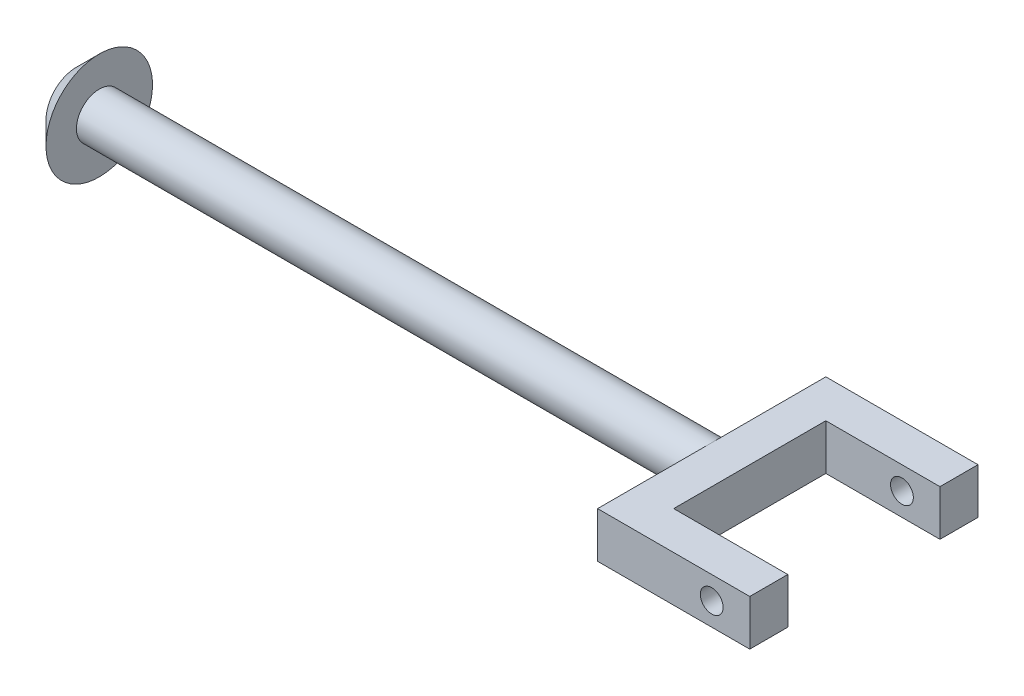
ISO-10303-21;
HEADER;
FILE_DESCRIPTION(('STEP AP214'),'2;1');
FILE_NAME('part.step','',(''),(''),'','','');
FILE_SCHEMA(('AUTOMOTIVE_DESIGN { 1 0 10303 214 1 1 1 1 }'));
ENDSEC;
DATA;
#1=APPLICATION_CONTEXT('core data for automotive mechanical design processes');
#2=APPLICATION_PROTOCOL_DEFINITION('international standard','automotive_design',2000,#1);
#3=PRODUCT_CONTEXT('',#1,'mechanical');
#4=PRODUCT('Part','Part','',(#3));
#5=PRODUCT_RELATED_PRODUCT_CATEGORY('part','',(#4));
#6=PRODUCT_DEFINITION_FORMATION('','',#4);
#7=PRODUCT_DEFINITION_CONTEXT('part definition',#1,'design');
#8=PRODUCT_DEFINITION('design','',#6,#7);
#9=PRODUCT_DEFINITION_SHAPE('','',#8);
#10=(LENGTH_UNIT() NAMED_UNIT(*) SI_UNIT(.MILLI.,.METRE.));
#11=(NAMED_UNIT(*) PLANE_ANGLE_UNIT() SI_UNIT($,.RADIAN.));
#12=(NAMED_UNIT(*) SI_UNIT($,.STERADIAN.) SOLID_ANGLE_UNIT());
#13=UNCERTAINTY_MEASURE_WITH_UNIT(LENGTH_MEASURE(1.E-05),#10,'distance_accuracy_value','');
#14=(GEOMETRIC_REPRESENTATION_CONTEXT(3) GLOBAL_UNCERTAINTY_ASSIGNED_CONTEXT((#13)) GLOBAL_UNIT_ASSIGNED_CONTEXT((#10,
#11,#12)) REPRESENTATION_CONTEXT('',''));
#15=CARTESIAN_POINT('',(0.,0.,0.));
#16=DIRECTION('',(0.,0.,1.));
#17=DIRECTION('',(1.,0.,0.));
#18=AXIS2_PLACEMENT_3D('',#15,#16,#17);
#19=CARTESIAN_POINT('',(99.9999999999999,0.,-125.));
#20=DIRECTION('',(-1.,0.,0.));
#21=DIRECTION('',(0.,0.,1.));
#22=AXIS2_PLACEMENT_3D('',#19,#20,#21);
#23=CYLINDRICAL_SURFACE('',#22,1.5);
#24=CARTESIAN_POINT('',(-2.75000000000007,0.,-125.));
#25=DIRECTION('',(1.,0.,0.));
#26=DIRECTION('',(0.,0.,-1.));
#27=AXIS2_PLACEMENT_3D('',#24,#25,#26);
#28=CIRCLE('',#27,1.5);
#29=CARTESIAN_POINT('',(-2.75000000000007,0.,-126.5));
#30=VERTEX_POINT('',#29);
#31=EDGE_CURVE('E206',#30,#30,#28,.T.);
#32=ORIENTED_EDGE('',*,*,#31,.T.);
#33=EDGE_LOOP('',(#32));
#34=FACE_BOUND('',#33,.T.);
#35=CARTESIAN_POINT('',(37.4999999999999,0.,-125.));
#36=DIRECTION('',(-1.,0.,0.));
#37=DIRECTION('',(0.,0.,1.));
#38=AXIS2_PLACEMENT_3D('',#35,#36,#37);
#39=CIRCLE('',#38,1.5);
#40=CARTESIAN_POINT('',(37.4999999999999,-1.5,-125.));
#41=VERTEX_POINT('',#40);
#42=CARTESIAN_POINT('',(37.4999999999999,1.5,-125.));
#43=VERTEX_POINT('',#42);
#44=EDGE_CURVE('E61',#41,#43,#39,.T.);
#45=ORIENTED_EDGE('',*,*,#44,.T.);
#46=EDGE_CURVE('E12',#43,#41,#39,.T.);
#47=ORIENTED_EDGE('',*,*,#46,.T.);
#48=EDGE_LOOP('',(#45,#47));
#49=FACE_BOUND('',#48,.T.);
#50=ADVANCED_FACE('F52',(#34,#49),#23,.T.);
#51=CARTESIAN_POINT('',(-2.75000000000007,0.,-125.));
#52=DIRECTION('',(1.,0.,0.));
#53=DIRECTION('',(0.,0.,-1.));
#54=AXIS2_PLACEMENT_3D('',#51,#52,#53);
#55=PLANE('',#54);
#56=ORIENTED_EDGE('',*,*,#31,.F.);
#57=EDGE_LOOP('',(#56));
#58=FACE_BOUND('',#57,.T.);
#59=CARTESIAN_POINT('',(-2.75000000000007,0.,-125.));
#60=DIRECTION('',(-1.,0.,0.));
#61=DIRECTION('',(0.,0.,1.));
#62=AXIS2_PLACEMENT_3D('',#59,#60,#61);
#63=CIRCLE('',#62,3.5);
#64=CARTESIAN_POINT('',(-2.75000000000007,0.,-121.5));
#65=VERTEX_POINT('',#64);
#66=EDGE_CURVE('E233',#65,#65,#63,.T.);
#67=ORIENTED_EDGE('',*,*,#66,.F.);
#68=EDGE_LOOP('',(#67));
#69=FACE_BOUND('',#68,.T.);
#70=ADVANCED_FACE('F274',(#58,#69),#55,.T.);
#71=CARTESIAN_POINT('',(-4.25000000000007,0.,-125.));
#72=DIRECTION('',(1.,0.,0.));
#73=DIRECTION('',(0.,0.,-1.));
#74=AXIS2_PLACEMENT_3D('',#71,#72,#73);
#75=CONICAL_SURFACE('',#74,2.00000000000003,0.785398163397439);
#76=ORIENTED_EDGE('',*,*,#66,.T.);
#77=EDGE_LOOP('',(#76));
#78=FACE_BOUND('',#77,.T.);
#79=CARTESIAN_POINT('',(-4.25000000000007,0.,-125.));
#80=DIRECTION('',(-1.,0.,0.));
#81=DIRECTION('',(0.,0.,1.));
#82=AXIS2_PLACEMENT_3D('',#79,#80,#81);
#83=CIRCLE('',#82,2.00000000000003);
#84=CARTESIAN_POINT('',(-4.25000000000007,0.,-123.));
#85=VERTEX_POINT('',#84);
#86=EDGE_CURVE('E229',#85,#85,#83,.T.);
#87=ORIENTED_EDGE('',*,*,#86,.F.);
#88=EDGE_LOOP('',(#87));
#89=FACE_BOUND('',#88,.T.);
#90=ADVANCED_FACE('F278',(#78,#89),#75,.T.);
#91=CARTESIAN_POINT('',(-4.25000000000007,0.,-125.));
#92=DIRECTION('',(1.,0.,0.));
#93=DIRECTION('',(0.,0.,-1.));
#94=AXIS2_PLACEMENT_3D('',#91,#92,#93);
#95=PLANE('',#94);
#96=CARTESIAN_POINT('',(-4.25000000000007,1.00000000000001,-125.));
#97=DIRECTION('',(-1.,0.,0.));
#98=DIRECTION('',(0.,0.,1.));
#99=AXIS2_PLACEMENT_3D('',#96,#97,#98);
#100=CIRCLE('',#99,0.25);
#101=CARTESIAN_POINT('',(-4.25000000000007,1.00000000000001,-124.75));
#102=VERTEX_POINT('',#101);
#103=EDGE_CURVE('E238',#102,#102,#100,.T.);
#104=ORIENTED_EDGE('',*,*,#103,.F.);
#105=EDGE_LOOP('',(#104));
#106=FACE_BOUND('',#105,.T.);
#107=ORIENTED_EDGE('',*,*,#86,.T.);
#108=EDGE_LOOP('',(#107));
#109=FACE_BOUND('',#108,.T.);
#110=ADVANCED_FACE('F287',(#106,#109),#95,.F.);
#111=CARTESIAN_POINT('',(-3.25000000000007,1.00000000000001,-125.));
#112=DIRECTION('',(-1.,0.,0.));
#113=DIRECTION('',(0.,0.,1.));
#114=AXIS2_PLACEMENT_3D('',#111,#112,#113);
#115=CYLINDRICAL_SURFACE('',#114,0.25);
#116=CARTESIAN_POINT('',(-3.25000000000007,1.00000000000001,-125.));
#117=DIRECTION('',(-1.,0.,0.));
#118=DIRECTION('',(0.,0.,1.));
#119=AXIS2_PLACEMENT_3D('',#116,#117,#118);
#120=CIRCLE('',#119,0.25);
#121=CARTESIAN_POINT('',(-3.25000000000007,1.00000000000001,-124.75));
#122=VERTEX_POINT('',#121);
#123=EDGE_CURVE('E237',#122,#122,#120,.T.);
#124=ORIENTED_EDGE('',*,*,#123,.F.);
#125=EDGE_LOOP('',(#124));
#126=FACE_BOUND('',#125,.T.);
#127=ORIENTED_EDGE('',*,*,#103,.T.);
#128=EDGE_LOOP('',(#127));
#129=FACE_BOUND('',#128,.T.);
#130=ADVANCED_FACE('F292',(#126,#129),#115,.F.);
#131=CARTESIAN_POINT('',(-3.25000000000007,1.00000000000001,-125.));
#132=DIRECTION('',(-1.,0.,0.));
#133=DIRECTION('',(0.,0.,1.));
#134=AXIS2_PLACEMENT_3D('',#131,#132,#133);
#135=PLANE('',#134);
#136=ORIENTED_EDGE('',*,*,#123,.T.);
#137=EDGE_LOOP('',(#136));
#138=FACE_BOUND('',#137,.T.);
#139=ADVANCED_FACE('F272',(#138),#135,.T.);
#140=CARTESIAN_POINT('',(37.4999999999999,-1.5,0.));
#141=DIRECTION('',(-1.,0.,0.));
#142=DIRECTION('',(0.,0.,1.));
#143=AXIS2_PLACEMENT_3D('',#140,#141,#142);
#144=PLANE('',#143);
#145=ORIENTED_EDGE('',*,*,#46,.F.);
#146=DIRECTION('',(0.,0.,1.));
#147=VECTOR('',#146,1.);
#148=CARTESIAN_POINT('',(37.4999999999999,1.5,0.));
#149=LINE('',#148,#147);
#150=CARTESIAN_POINT('',(37.4999999999999,1.5,-132.5));
#151=VERTEX_POINT('',#150);
#152=EDGE_CURVE('E68',#151,#43,#149,.T.);
#153=ORIENTED_EDGE('',*,*,#152,.F.);
#154=DIRECTION('',(0.,1.,0.));
#155=VECTOR('',#154,1.);
#156=CARTESIAN_POINT('',(37.4999999999999,-1.5,-132.5));
#157=LINE('',#156,#155);
#158=CARTESIAN_POINT('',(37.4999999999999,-1.5,-132.5));
#159=VERTEX_POINT('',#158);
#160=EDGE_CURVE('E207',#159,#151,#157,.T.);
#161=ORIENTED_EDGE('',*,*,#160,.F.);
#162=DIRECTION('',(0.,0.,1.));
#163=VECTOR('',#162,1.);
#164=CARTESIAN_POINT('',(37.4999999999999,-1.5,0.));
#165=LINE('',#164,#163);
#166=EDGE_CURVE('E137',#159,#41,#165,.T.);
#167=ORIENTED_EDGE('',*,*,#166,.T.);
#168=EDGE_LOOP('',(#145,#153,#161,#167));
#169=FACE_BOUND('',#168,.T.);
#170=ADVANCED_FACE('F248',(#169),#144,.T.);
#171=CARTESIAN_POINT('',(0.,-1.5,0.));
#172=DIRECTION('',(0.,1.,0.));
#173=DIRECTION('',(0.,0.,1.));
#174=AXIS2_PLACEMENT_3D('',#171,#172,#173);
#175=PLANE('',#174);
#176=DIRECTION('',(0.,0.,1.));
#177=VECTOR('',#176,1.);
#178=CARTESIAN_POINT('',(39.9999999999999,-1.5,0.));
#179=LINE('',#178,#177);
#180=CARTESIAN_POINT('',(39.9999999999999,-1.5,-130.));
#181=VERTEX_POINT('',#180);
#182=CARTESIAN_POINT('',(39.9999999999999,-1.5,-120.));
#183=VERTEX_POINT('',#182);
#184=EDGE_CURVE('E186',#181,#183,#179,.T.);
#185=ORIENTED_EDGE('',*,*,#184,.T.);
#186=DIRECTION('',(1.,0.,0.));
#187=VECTOR('',#186,1.);
#188=CARTESIAN_POINT('',(0.,-1.5,-120.));
#189=LINE('',#188,#187);
#190=CARTESIAN_POINT('',(47.4999999999999,-1.5,-120.));
#191=VERTEX_POINT('',#190);
#192=EDGE_CURVE('E183',#183,#191,#189,.T.);
#193=ORIENTED_EDGE('',*,*,#192,.T.);
#194=DIRECTION('',(0.,0.,-1.));
#195=VECTOR('',#194,1.);
#196=CARTESIAN_POINT('',(47.4999999999999,-1.5,0.));
#197=LINE('',#196,#195);
#198=CARTESIAN_POINT('',(47.4999999999999,-1.5,-117.5));
#199=VERTEX_POINT('',#198);
#200=EDGE_CURVE('E180',#199,#191,#197,.T.);
#201=ORIENTED_EDGE('',*,*,#200,.F.);
#202=DIRECTION('',(1.,0.,0.));
#203=VECTOR('',#202,1.);
#204=CARTESIAN_POINT('',(0.,-1.5,-117.5));
#205=LINE('',#204,#203);
#206=CARTESIAN_POINT('',(37.4999999999999,-1.5,-117.5));
#207=VERTEX_POINT('',#206);
#208=EDGE_CURVE('E131',#207,#199,#205,.T.);
#209=ORIENTED_EDGE('',*,*,#208,.F.);
#210=EDGE_CURVE('E199',#41,#207,#165,.T.);
#211=ORIENTED_EDGE('',*,*,#210,.F.);
#212=ORIENTED_EDGE('',*,*,#166,.F.);
#213=DIRECTION('',(1.,0.,0.));
#214=VECTOR('',#213,1.);
#215=CARTESIAN_POINT('',(0.,-1.5,-132.5));
#216=LINE('',#215,#214);
#217=CARTESIAN_POINT('',(47.4999999999999,-1.5,-132.5));
#218=VERTEX_POINT('',#217);
#219=EDGE_CURVE('E196',#159,#218,#216,.T.);
#220=ORIENTED_EDGE('',*,*,#219,.T.);
#221=DIRECTION('',(0.,0.,1.));
#222=VECTOR('',#221,1.);
#223=CARTESIAN_POINT('',(47.4999999999999,-1.5,0.));
#224=LINE('',#223,#222);
#225=CARTESIAN_POINT('',(47.4999999999999,-1.5,-130.));
#226=VERTEX_POINT('',#225);
#227=EDGE_CURVE('E193',#218,#226,#224,.T.);
#228=ORIENTED_EDGE('',*,*,#227,.T.);
#229=DIRECTION('',(1.,0.,0.));
#230=VECTOR('',#229,1.);
#231=CARTESIAN_POINT('',(0.,-1.5,-130.));
#232=LINE('',#231,#230);
#233=EDGE_CURVE('E189',#181,#226,#232,.T.);
#234=ORIENTED_EDGE('',*,*,#233,.F.);
#235=EDGE_LOOP('',(#185,#193,#201,#209,#211,#212,#220,#228,#234));
#236=FACE_BOUND('',#235,.T.);
#237=ADVANCED_FACE('F252',(#236),#175,.F.);
#238=CARTESIAN_POINT('',(0.,1.5,0.));
#239=DIRECTION('',(0.,1.,0.));
#240=DIRECTION('',(0.,0.,1.));
#241=AXIS2_PLACEMENT_3D('',#238,#239,#240);
#242=PLANE('',#241);
#243=ORIENTED_EDGE('',*,*,#152,.T.);
#244=CARTESIAN_POINT('',(37.4999999999999,1.5,-117.5));
#245=VERTEX_POINT('',#244);
#246=EDGE_CURVE('E149',#43,#245,#149,.T.);
#247=ORIENTED_EDGE('',*,*,#246,.T.);
#248=DIRECTION('',(1.,0.,0.));
#249=VECTOR('',#248,1.);
#250=CARTESIAN_POINT('',(0.,1.5,-117.5));
#251=LINE('',#250,#249);
#252=CARTESIAN_POINT('',(47.4999999999999,1.5,-117.5));
#253=VERTEX_POINT('',#252);
#254=EDGE_CURVE('E129',#245,#253,#251,.T.);
#255=ORIENTED_EDGE('',*,*,#254,.T.);
#256=DIRECTION('',(0.,0.,-1.));
#257=VECTOR('',#256,1.);
#258=CARTESIAN_POINT('',(47.4999999999999,1.5,0.));
#259=LINE('',#258,#257);
#260=CARTESIAN_POINT('',(47.4999999999999,1.5,-120.));
#261=VERTEX_POINT('',#260);
#262=EDGE_CURVE('E140',#253,#261,#259,.T.);
#263=ORIENTED_EDGE('',*,*,#262,.T.);
#264=DIRECTION('',(1.,0.,0.));
#265=VECTOR('',#264,1.);
#266=CARTESIAN_POINT('',(0.,1.5,-120.));
#267=LINE('',#266,#265);
#268=CARTESIAN_POINT('',(39.9999999999999,1.5,-120.));
#269=VERTEX_POINT('',#268);
#270=EDGE_CURVE('E146',#269,#261,#267,.T.);
#271=ORIENTED_EDGE('',*,*,#270,.F.);
#272=DIRECTION('',(0.,0.,1.));
#273=VECTOR('',#272,1.);
#274=CARTESIAN_POINT('',(39.9999999999999,1.5,0.));
#275=LINE('',#274,#273);
#276=CARTESIAN_POINT('',(39.9999999999999,1.5,-130.));
#277=VERTEX_POINT('',#276);
#278=EDGE_CURVE('E161',#277,#269,#275,.T.);
#279=ORIENTED_EDGE('',*,*,#278,.F.);
#280=DIRECTION('',(1.,0.,0.));
#281=VECTOR('',#280,1.);
#282=CARTESIAN_POINT('',(0.,1.5,-130.));
#283=LINE('',#282,#281);
#284=CARTESIAN_POINT('',(47.4999999999999,1.5,-130.));
#285=VERTEX_POINT('',#284);
#286=EDGE_CURVE('E164',#277,#285,#283,.T.);
#287=ORIENTED_EDGE('',*,*,#286,.T.);
#288=DIRECTION('',(0.,0.,1.));
#289=VECTOR('',#288,1.);
#290=CARTESIAN_POINT('',(47.4999999999999,1.5,0.));
#291=LINE('',#290,#289);
#292=CARTESIAN_POINT('',(47.4999999999999,1.5,-132.5));
#293=VERTEX_POINT('',#292);
#294=EDGE_CURVE('E168',#293,#285,#291,.T.);
#295=ORIENTED_EDGE('',*,*,#294,.F.);
#296=DIRECTION('',(1.,0.,0.));
#297=VECTOR('',#296,1.);
#298=CARTESIAN_POINT('',(0.,1.5,-132.5));
#299=LINE('',#298,#297);
#300=EDGE_CURVE('E172',#151,#293,#299,.T.);
#301=ORIENTED_EDGE('',*,*,#300,.F.);
#302=EDGE_LOOP('',(#243,#247,#255,#263,#271,#279,#287,#295,#301));
#303=FACE_BOUND('',#302,.T.);
#304=ADVANCED_FACE('F148',(#303),#242,.T.);
#305=CARTESIAN_POINT('',(0.,-1.5,-117.5));
#306=DIRECTION('',(0.,0.,1.));
#307=DIRECTION('',(1.,0.,0.));
#308=AXIS2_PLACEMENT_3D('',#305,#306,#307);
#309=PLANE('',#308);
#310=CARTESIAN_POINT('',(44.9999999999999,0.,-117.5));
#311=DIRECTION('',(0.,0.,1.));
#312=DIRECTION('',(1.,0.,0.));
#313=AXIS2_PLACEMENT_3D('',#310,#311,#312);
#314=CIRCLE('',#313,0.749999999999999);
#315=CARTESIAN_POINT('',(45.7499999999999,0.,-117.5));
#316=VERTEX_POINT('',#315);
#317=EDGE_CURVE('E445',#316,#316,#314,.T.);
#318=ORIENTED_EDGE('',*,*,#317,.F.);
#319=EDGE_LOOP('',(#318));
#320=FACE_BOUND('',#319,.T.);
#321=DIRECTION('',(0.,1.,0.));
#322=VECTOR('',#321,1.);
#323=CARTESIAN_POINT('',(47.4999999999999,-1.5,-117.5));
#324=LINE('',#323,#322);
#325=EDGE_CURVE('E124',#199,#253,#324,.T.);
#326=ORIENTED_EDGE('',*,*,#325,.T.);
#327=ORIENTED_EDGE('',*,*,#254,.F.);
#328=DIRECTION('',(0.,1.,0.));
#329=VECTOR('',#328,1.);
#330=CARTESIAN_POINT('',(37.4999999999999,-1.5,-117.5));
#331=LINE('',#330,#329);
#332=EDGE_CURVE('E203',#207,#245,#331,.T.);
#333=ORIENTED_EDGE('',*,*,#332,.F.);
#334=ORIENTED_EDGE('',*,*,#208,.T.);
#335=EDGE_LOOP('',(#326,#327,#333,#334));
#336=FACE_BOUND('',#335,.T.);
#337=ADVANCED_FACE('F126',(#320,#336),#309,.T.);
#338=ORIENTED_EDGE('',*,*,#44,.F.);
#339=ORIENTED_EDGE('',*,*,#210,.T.);
#340=ORIENTED_EDGE('',*,*,#332,.T.);
#341=ORIENTED_EDGE('',*,*,#246,.F.);
#342=EDGE_LOOP('',(#338,#339,#340,#341));
#343=FACE_BOUND('',#342,.T.);
#344=ADVANCED_FACE('F256',(#343),#144,.T.);
#345=CARTESIAN_POINT('',(0.,-1.5,-132.5));
#346=DIRECTION('',(0.,0.,1.));
#347=DIRECTION('',(1.,0.,0.));
#348=AXIS2_PLACEMENT_3D('',#345,#346,#347);
#349=PLANE('',#348);
#350=CARTESIAN_POINT('',(44.9999999999999,0.,-132.5));
#351=DIRECTION('',(0.,0.,1.));
#352=DIRECTION('',(1.,0.,0.));
#353=AXIS2_PLACEMENT_3D('',#350,#351,#352);
#354=CIRCLE('',#353,0.749999999999999);
#355=CARTESIAN_POINT('',(45.7499999999999,0.,-132.5));
#356=VERTEX_POINT('',#355);
#357=EDGE_CURVE('E443',#356,#356,#354,.T.);
#358=ORIENTED_EDGE('',*,*,#357,.T.);
#359=EDGE_LOOP('',(#358));
#360=FACE_BOUND('',#359,.T.);
#361=ORIENTED_EDGE('',*,*,#160,.T.);
#362=ORIENTED_EDGE('',*,*,#300,.T.);
#363=DIRECTION('',(0.,1.,0.));
#364=VECTOR('',#363,1.);
#365=CARTESIAN_POINT('',(47.4999999999999,-1.5,-132.5));
#366=LINE('',#365,#364);
#367=EDGE_CURVE('E210',#218,#293,#366,.T.);
#368=ORIENTED_EDGE('',*,*,#367,.F.);
#369=ORIENTED_EDGE('',*,*,#219,.F.);
#370=EDGE_LOOP('',(#361,#362,#368,#369));
#371=FACE_BOUND('',#370,.T.);
#372=ADVANCED_FACE('F258',(#360,#371),#349,.F.);
#373=CARTESIAN_POINT('',(47.4999999999999,-1.5,0.));
#374=DIRECTION('',(-1.,0.,0.));
#375=DIRECTION('',(0.,0.,1.));
#376=AXIS2_PLACEMENT_3D('',#373,#374,#375);
#377=PLANE('',#376);
#378=ORIENTED_EDGE('',*,*,#367,.T.);
#379=ORIENTED_EDGE('',*,*,#294,.T.);
#380=DIRECTION('',(0.,1.,0.));
#381=VECTOR('',#380,1.);
#382=CARTESIAN_POINT('',(47.4999999999999,-1.5,-130.));
#383=LINE('',#382,#381);
#384=EDGE_CURVE('E213',#226,#285,#383,.T.);
#385=ORIENTED_EDGE('',*,*,#384,.F.);
#386=ORIENTED_EDGE('',*,*,#227,.F.);
#387=EDGE_LOOP('',(#378,#379,#385,#386));
#388=FACE_BOUND('',#387,.T.);
#389=ADVANCED_FACE('F264',(#388),#377,.F.);
#390=CARTESIAN_POINT('',(0.,-1.5,-130.));
#391=DIRECTION('',(0.,0.,1.));
#392=DIRECTION('',(1.,0.,0.));
#393=AXIS2_PLACEMENT_3D('',#390,#391,#392);
#394=PLANE('',#393);
#395=CARTESIAN_POINT('',(44.9999999999999,0.,-130.));
#396=DIRECTION('',(0.,0.,1.));
#397=DIRECTION('',(1.,0.,0.));
#398=AXIS2_PLACEMENT_3D('',#395,#396,#397);
#399=CIRCLE('',#398,0.749999999999999);
#400=CARTESIAN_POINT('',(45.7499999999999,0.,-130.));
#401=VERTEX_POINT('',#400);
#402=EDGE_CURVE('E152',#401,#401,#399,.T.);
#403=ORIENTED_EDGE('',*,*,#402,.F.);
#404=EDGE_LOOP('',(#403));
#405=FACE_BOUND('',#404,.T.);
#406=ORIENTED_EDGE('',*,*,#384,.T.);
#407=ORIENTED_EDGE('',*,*,#286,.F.);
#408=DIRECTION('',(0.,1.,0.));
#409=VECTOR('',#408,1.);
#410=CARTESIAN_POINT('',(39.9999999999999,-1.5,-130.));
#411=LINE('',#410,#409);
#412=EDGE_CURVE('E216',#181,#277,#411,.T.);
#413=ORIENTED_EDGE('',*,*,#412,.F.);
#414=ORIENTED_EDGE('',*,*,#233,.T.);
#415=EDGE_LOOP('',(#406,#407,#413,#414));
#416=FACE_BOUND('',#415,.T.);
#417=ADVANCED_FACE('F323',(#405,#416),#394,.T.);
#418=CARTESIAN_POINT('',(0.,-1.5,-120.));
#419=DIRECTION('',(0.,0.,1.));
#420=DIRECTION('',(1.,0.,0.));
#421=AXIS2_PLACEMENT_3D('',#418,#419,#420);
#422=PLANE('',#421);
#423=CARTESIAN_POINT('',(44.9999999999999,0.,-120.));
#424=DIRECTION('',(0.,0.,1.));
#425=DIRECTION('',(1.,0.,0.));
#426=AXIS2_PLACEMENT_3D('',#423,#424,#425);
#427=CIRCLE('',#426,0.749999999999999);
#428=CARTESIAN_POINT('',(45.7499999999999,0.,-120.));
#429=VERTEX_POINT('',#428);
#430=EDGE_CURVE('E55',#429,#429,#427,.T.);
#431=ORIENTED_EDGE('',*,*,#430,.T.);
#432=EDGE_LOOP('',(#431));
#433=FACE_BOUND('',#432,.T.);
#434=DIRECTION('',(0.,1.,0.));
#435=VECTOR('',#434,1.);
#436=CARTESIAN_POINT('',(39.9999999999999,-1.5,-120.));
#437=LINE('',#436,#435);
#438=EDGE_CURVE('E220',#183,#269,#437,.T.);
#439=ORIENTED_EDGE('',*,*,#438,.T.);
#440=ORIENTED_EDGE('',*,*,#270,.T.);
#441=DIRECTION('',(0.,1.,0.));
#442=VECTOR('',#441,1.);
#443=CARTESIAN_POINT('',(47.4999999999999,-1.5,-120.));
#444=LINE('',#443,#442);
#445=EDGE_CURVE('E136',#191,#261,#444,.T.);
#446=ORIENTED_EDGE('',*,*,#445,.F.);
#447=ORIENTED_EDGE('',*,*,#192,.F.);
#448=EDGE_LOOP('',(#439,#440,#446,#447));
#449=FACE_BOUND('',#448,.T.);
#450=ADVANCED_FACE('F316',(#433,#449),#422,.F.);
#451=CARTESIAN_POINT('',(47.4999999999999,-1.5,0.));
#452=DIRECTION('',(1.,0.,0.));
#453=DIRECTION('',(0.,0.,-1.));
#454=AXIS2_PLACEMENT_3D('',#451,#452,#453);
#455=PLANE('',#454);
#456=ORIENTED_EDGE('',*,*,#445,.T.);
#457=ORIENTED_EDGE('',*,*,#262,.F.);
#458=ORIENTED_EDGE('',*,*,#325,.F.);
#459=ORIENTED_EDGE('',*,*,#200,.T.);
#460=EDGE_LOOP('',(#456,#457,#458,#459));
#461=FACE_BOUND('',#460,.T.);
#462=ADVANCED_FACE('F141',(#461),#455,.T.);
#463=CARTESIAN_POINT('',(39.9999999999999,1.5,-130.));
#464=DIRECTION('',(1.,0.,0.));
#465=DIRECTION('',(0.,0.,-1.));
#466=AXIS2_PLACEMENT_3D('',#463,#464,#465);
#467=PLANE('',#466);
#468=ORIENTED_EDGE('',*,*,#412,.T.);
#469=ORIENTED_EDGE('',*,*,#278,.T.);
#470=ORIENTED_EDGE('',*,*,#438,.F.);
#471=ORIENTED_EDGE('',*,*,#184,.F.);
#472=EDGE_LOOP('',(#468,#469,#470,#471));
#473=FACE_BOUND('',#472,.T.);
#474=ADVANCED_FACE('F306',(#473),#467,.T.);
#475=CARTESIAN_POINT('',(44.9999999999999,0.,-132.5));
#476=DIRECTION('',(0.,0.,1.));
#477=DIRECTION('',(1.,0.,0.));
#478=AXIS2_PLACEMENT_3D('',#475,#476,#477);
#479=CYLINDRICAL_SURFACE('',#478,0.749999999999999);
#480=ORIENTED_EDGE('',*,*,#317,.T.);
#481=EDGE_LOOP('',(#480));
#482=FACE_BOUND('',#481,.T.);
#483=ORIENTED_EDGE('',*,*,#430,.F.);
#484=EDGE_LOOP('',(#483));
#485=FACE_BOUND('',#484,.T.);
#486=ADVANCED_FACE('F308',(#482,#485),#479,.F.);
#487=ORIENTED_EDGE('',*,*,#402,.T.);
#488=EDGE_LOOP('',(#487));
#489=FACE_BOUND('',#488,.T.);
#490=ORIENTED_EDGE('',*,*,#357,.F.);
#491=EDGE_LOOP('',(#490));
#492=FACE_BOUND('',#491,.T.);
#493=ADVANCED_FACE('F313',(#489,#492),#479,.F.);
#494=CLOSED_SHELL('',(#50,#70,#90,#110,#130,#139,#170,#237,#304,#337,#344,#372,#389,#417,#450,
#462,#474,#486,#493));
#495=MANIFOLD_SOLID_BREP('B2',#494);
#496=ADVANCED_BREP_SHAPE_REPRESENTATION('',(#18,#495),#14);
#497=SHAPE_DEFINITION_REPRESENTATION(#9,#496);
ENDSEC;
END-ISO-10303-21;
